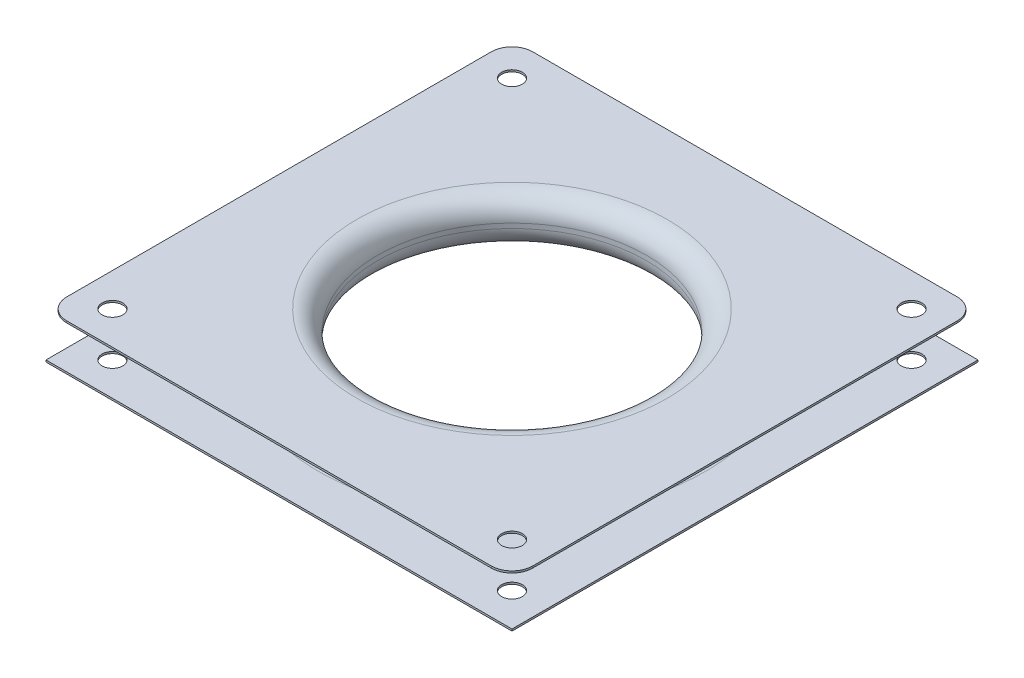
ISO-10303-21;
HEADER;
FILE_DESCRIPTION(('STEP AP214'),'2;1');
FILE_NAME('part.step','',(''),(''),'','','');
FILE_SCHEMA(('AUTOMOTIVE_DESIGN { 1 0 10303 214 1 1 1 1 }'));
ENDSEC;
DATA;
#1=APPLICATION_CONTEXT('core data for automotive mechanical design processes');
#2=APPLICATION_PROTOCOL_DEFINITION('international standard','automotive_design',2000,#1);
#3=PRODUCT_CONTEXT('',#1,'mechanical');
#4=PRODUCT('Part','Part','',(#3));
#5=PRODUCT_RELATED_PRODUCT_CATEGORY('part','',(#4));
#6=PRODUCT_DEFINITION_FORMATION('','',#4);
#7=PRODUCT_DEFINITION_CONTEXT('part definition',#1,'design');
#8=PRODUCT_DEFINITION('design','',#6,#7);
#9=PRODUCT_DEFINITION_SHAPE('','',#8);
#10=(LENGTH_UNIT() NAMED_UNIT(*) SI_UNIT(.MILLI.,.METRE.));
#11=(NAMED_UNIT(*) PLANE_ANGLE_UNIT() SI_UNIT($,.RADIAN.));
#12=(NAMED_UNIT(*) SI_UNIT($,.STERADIAN.) SOLID_ANGLE_UNIT());
#13=UNCERTAINTY_MEASURE_WITH_UNIT(LENGTH_MEASURE(1.E-05),#10,'distance_accuracy_value','');
#14=(GEOMETRIC_REPRESENTATION_CONTEXT(3) GLOBAL_UNCERTAINTY_ASSIGNED_CONTEXT((#13)) GLOBAL_UNIT_ASSIGNED_CONTEXT((#10,
#11,#12)) REPRESENTATION_CONTEXT('',''));
#15=CARTESIAN_POINT('',(0.,0.,0.));
#16=DIRECTION('',(0.,0.,1.));
#17=DIRECTION('',(1.,0.,0.));
#18=AXIS2_PLACEMENT_3D('',#15,#16,#17);
#19=CARTESIAN_POINT('',(47.25,9.35,47.25));
#20=DIRECTION('',(-1.,0.,0.));
#21=DIRECTION('',(0.,0.,1.));
#22=AXIS2_PLACEMENT_3D('',#19,#20,#21);
#23=PLANE('',#22);
#24=DIRECTION('',(0.,-1.,0.));
#25=VECTOR('',#24,1.);
#26=CARTESIAN_POINT('',(47.25,9.35,-47.25));
#27=LINE('',#26,#25);
#28=CARTESIAN_POINT('',(47.25,0.380999999999999,-47.25));
#29=VERTEX_POINT('',#28);
#30=CARTESIAN_POINT('',(47.25,0.,-47.25));
#31=VERTEX_POINT('',#30);
#32=EDGE_CURVE('E150',#29,#31,#27,.T.);
#33=ORIENTED_EDGE('',*,*,#32,.F.);
#34=DIRECTION('',(0.,0.,1.));
#35=VECTOR('',#34,1.);
#36=CARTESIAN_POINT('',(47.25,0.380999999999999,47.25));
#37=LINE('',#36,#35);
#38=CARTESIAN_POINT('',(47.25,0.380999999999999,47.25));
#39=VERTEX_POINT('',#38);
#40=EDGE_CURVE('E135',#29,#39,#37,.T.);
#41=ORIENTED_EDGE('',*,*,#40,.T.);
#42=DIRECTION('',(0.,-1.,0.));
#43=VECTOR('',#42,1.);
#44=CARTESIAN_POINT('',(47.25,9.35,47.25));
#45=LINE('',#44,#43);
#46=CARTESIAN_POINT('',(47.25,0.,47.25));
#47=VERTEX_POINT('',#46);
#48=EDGE_CURVE('E148',#39,#47,#45,.T.);
#49=ORIENTED_EDGE('',*,*,#48,.T.);
#50=DIRECTION('',(0.,0.,-1.));
#51=VECTOR('',#50,1.);
#52=CARTESIAN_POINT('',(47.25,0.,47.25));
#53=LINE('',#52,#51);
#54=EDGE_CURVE('E335',#47,#31,#53,.T.);
#55=ORIENTED_EDGE('',*,*,#54,.T.);
#56=EDGE_LOOP('',(#33,#41,#49,#55));
#57=FACE_BOUND('',#56,.T.);
#58=ADVANCED_FACE('F43',(#57),#23,.F.);
#59=CARTESIAN_POINT('',(-47.25,9.35,-47.25));
#60=DIRECTION('',(0.,0.,1.));
#61=DIRECTION('',(1.,0.,0.));
#62=AXIS2_PLACEMENT_3D('',#59,#60,#61);
#63=PLANE('',#62);
#64=DIRECTION('',(0.,-1.,0.));
#65=VECTOR('',#64,1.);
#66=CARTESIAN_POINT('',(-47.25,9.35,-47.25));
#67=LINE('',#66,#65);
#68=CARTESIAN_POINT('',(-47.25,0.380999999999999,-47.25));
#69=VERTEX_POINT('',#68);
#70=CARTESIAN_POINT('',(-47.25,0.,-47.25));
#71=VERTEX_POINT('',#70);
#72=EDGE_CURVE('E165',#69,#71,#67,.T.);
#73=ORIENTED_EDGE('',*,*,#72,.F.);
#74=DIRECTION('',(1.,0.,0.));
#75=VECTOR('',#74,1.);
#76=CARTESIAN_POINT('',(-47.25,0.380999999999999,-47.25));
#77=LINE('',#76,#75);
#78=EDGE_CURVE('E153',#69,#29,#77,.T.);
#79=ORIENTED_EDGE('',*,*,#78,.T.);
#80=ORIENTED_EDGE('',*,*,#32,.T.);
#81=DIRECTION('',(-1.,0.,0.));
#82=VECTOR('',#81,1.);
#83=CARTESIAN_POINT('',(-47.25,0.,-47.25));
#84=LINE('',#83,#82);
#85=EDGE_CURVE('E351',#31,#71,#84,.T.);
#86=ORIENTED_EDGE('',*,*,#85,.T.);
#87=EDGE_LOOP('',(#73,#79,#80,#86));
#88=FACE_BOUND('',#87,.T.);
#89=ADVANCED_FACE('F367',(#88),#63,.F.);
#90=CARTESIAN_POINT('',(-47.25,9.35,47.25));
#91=DIRECTION('',(1.,0.,0.));
#92=DIRECTION('',(0.,0.,-1.));
#93=AXIS2_PLACEMENT_3D('',#90,#91,#92);
#94=PLANE('',#93);
#95=DIRECTION('',(0.,-1.,0.));
#96=VECTOR('',#95,1.);
#97=CARTESIAN_POINT('',(-47.25,9.35,47.25));
#98=LINE('',#97,#96);
#99=CARTESIAN_POINT('',(-47.25,0.380999999999999,47.25));
#100=VERTEX_POINT('',#99);
#101=CARTESIAN_POINT('',(-47.25,0.,47.25));
#102=VERTEX_POINT('',#101);
#103=EDGE_CURVE('E160',#100,#102,#98,.T.);
#104=ORIENTED_EDGE('',*,*,#103,.F.);
#105=DIRECTION('',(0.,0.,-1.));
#106=VECTOR('',#105,1.);
#107=CARTESIAN_POINT('',(-47.25,0.380999999999999,47.25));
#108=LINE('',#107,#106);
#109=EDGE_CURVE('E138',#100,#69,#108,.T.);
#110=ORIENTED_EDGE('',*,*,#109,.T.);
#111=ORIENTED_EDGE('',*,*,#72,.T.);
#112=DIRECTION('',(0.,0.,1.));
#113=VECTOR('',#112,1.);
#114=CARTESIAN_POINT('',(-47.25,0.,47.25));
#115=LINE('',#114,#113);
#116=EDGE_CURVE('E354',#71,#102,#115,.T.);
#117=ORIENTED_EDGE('',*,*,#116,.T.);
#118=EDGE_LOOP('',(#104,#110,#111,#117));
#119=FACE_BOUND('',#118,.T.);
#120=ADVANCED_FACE('F360',(#119),#94,.F.);
#121=CARTESIAN_POINT('',(-47.25,9.35,47.25));
#122=DIRECTION('',(0.,0.,-1.));
#123=DIRECTION('',(-1.,0.,0.));
#124=AXIS2_PLACEMENT_3D('',#121,#122,#123);
#125=PLANE('',#124);
#126=ORIENTED_EDGE('',*,*,#48,.F.);
#127=DIRECTION('',(-1.,0.,0.));
#128=VECTOR('',#127,1.);
#129=CARTESIAN_POINT('',(-47.25,0.380999999999999,47.25));
#130=LINE('',#129,#128);
#131=EDGE_CURVE('E132',#39,#100,#130,.T.);
#132=ORIENTED_EDGE('',*,*,#131,.T.);
#133=ORIENTED_EDGE('',*,*,#103,.T.);
#134=DIRECTION('',(1.,0.,0.));
#135=VECTOR('',#134,1.);
#136=CARTESIAN_POINT('',(-47.25,0.,47.25));
#137=LINE('',#136,#135);
#138=EDGE_CURVE('E157',#102,#47,#137,.T.);
#139=ORIENTED_EDGE('',*,*,#138,.T.);
#140=EDGE_LOOP('',(#126,#132,#133,#139));
#141=FACE_BOUND('',#140,.T.);
#142=ADVANCED_FACE('F155',(#141),#125,.F.);
#143=CARTESIAN_POINT('',(-40.513,9.35,-40.513));
#144=DIRECTION('',(0.,-1.,0.));
#145=DIRECTION('',(0.,0.,-1.));
#146=AXIS2_PLACEMENT_3D('',#143,#144,#145);
#147=CYLINDRICAL_SURFACE('',#146,2.1);
#148=CARTESIAN_POINT('',(-40.513,0.380999999999999,-40.513));
#149=DIRECTION('',(0.,-1.,0.));
#150=DIRECTION('',(0.,0.,-1.));
#151=AXIS2_PLACEMENT_3D('',#148,#149,#150);
#152=CIRCLE('',#151,2.1);
#153=CARTESIAN_POINT('',(-40.513,0.380999999999999,-42.613));
#154=VERTEX_POINT('',#153);
#155=EDGE_CURVE('E143',#154,#154,#152,.T.);
#156=ORIENTED_EDGE('',*,*,#155,.F.);
#157=EDGE_LOOP('',(#156));
#158=FACE_BOUND('',#157,.T.);
#159=CARTESIAN_POINT('',(-40.513,0.,-40.513));
#160=DIRECTION('',(0.,1.,0.));
#161=DIRECTION('',(0.,0.,1.));
#162=AXIS2_PLACEMENT_3D('',#159,#160,#161);
#163=CIRCLE('',#162,2.1);
#164=CARTESIAN_POINT('',(-40.513,0.,-38.413));
#165=VERTEX_POINT('',#164);
#166=EDGE_CURVE('E327',#165,#165,#163,.T.);
#167=ORIENTED_EDGE('',*,*,#166,.F.);
#168=EDGE_LOOP('',(#167));
#169=FACE_BOUND('',#168,.T.);
#170=ADVANCED_FACE('F463',(#158,#169),#147,.F.);
#171=CARTESIAN_POINT('',(40.513,9.35,-40.513));
#172=DIRECTION('',(0.,-1.,0.));
#173=DIRECTION('',(0.,0.,-1.));
#174=AXIS2_PLACEMENT_3D('',#171,#172,#173);
#175=CYLINDRICAL_SURFACE('',#174,2.1);
#176=CARTESIAN_POINT('',(40.513,0.380999999999999,-40.513));
#177=DIRECTION('',(0.,-1.,0.));
#178=DIRECTION('',(0.,0.,-1.));
#179=AXIS2_PLACEMENT_3D('',#176,#177,#178);
#180=CIRCLE('',#179,2.1);
#181=CARTESIAN_POINT('',(40.513,0.380999999999999,-42.613));
#182=VERTEX_POINT('',#181);
#183=EDGE_CURVE('E296',#182,#182,#180,.T.);
#184=ORIENTED_EDGE('',*,*,#183,.F.);
#185=EDGE_LOOP('',(#184));
#186=FACE_BOUND('',#185,.T.);
#187=CARTESIAN_POINT('',(40.513,0.,-40.513));
#188=DIRECTION('',(0.,1.,0.));
#189=DIRECTION('',(0.,0.,1.));
#190=AXIS2_PLACEMENT_3D('',#187,#188,#189);
#191=CIRCLE('',#190,2.1);
#192=CARTESIAN_POINT('',(40.513,0.,-38.413));
#193=VERTEX_POINT('',#192);
#194=EDGE_CURVE('E319',#193,#193,#191,.T.);
#195=ORIENTED_EDGE('',*,*,#194,.F.);
#196=EDGE_LOOP('',(#195));
#197=FACE_BOUND('',#196,.T.);
#198=ADVANCED_FACE('F495',(#186,#197),#175,.F.);
#199=CARTESIAN_POINT('',(40.513,9.35,40.513));
#200=DIRECTION('',(0.,-1.,0.));
#201=DIRECTION('',(0.,0.,-1.));
#202=AXIS2_PLACEMENT_3D('',#199,#200,#201);
#203=CYLINDRICAL_SURFACE('',#202,2.1);
#204=CARTESIAN_POINT('',(40.513,0.380999999999999,40.513));
#205=DIRECTION('',(0.,-1.,0.));
#206=DIRECTION('',(0.,0.,-1.));
#207=AXIS2_PLACEMENT_3D('',#204,#205,#206);
#208=CIRCLE('',#207,2.1);
#209=CARTESIAN_POINT('',(40.513,0.380999999999999,38.413));
#210=VERTEX_POINT('',#209);
#211=EDGE_CURVE('E186',#210,#210,#208,.T.);
#212=ORIENTED_EDGE('',*,*,#211,.F.);
#213=EDGE_LOOP('',(#212));
#214=FACE_BOUND('',#213,.T.);
#215=CARTESIAN_POINT('',(40.513,0.,40.513));
#216=DIRECTION('',(0.,1.,0.));
#217=DIRECTION('',(0.,0.,1.));
#218=AXIS2_PLACEMENT_3D('',#215,#216,#217);
#219=CIRCLE('',#218,2.1);
#220=CARTESIAN_POINT('',(40.513,0.,42.613));
#221=VERTEX_POINT('',#220);
#222=EDGE_CURVE('E311',#221,#221,#219,.T.);
#223=ORIENTED_EDGE('',*,*,#222,.F.);
#224=EDGE_LOOP('',(#223));
#225=FACE_BOUND('',#224,.T.);
#226=ADVANCED_FACE('F489',(#214,#225),#203,.F.);
#227=CARTESIAN_POINT('',(-40.513,9.35,40.513));
#228=DIRECTION('',(0.,-1.,0.));
#229=DIRECTION('',(0.,0.,-1.));
#230=AXIS2_PLACEMENT_3D('',#227,#228,#229);
#231=CYLINDRICAL_SURFACE('',#230,2.1);
#232=CARTESIAN_POINT('',(-40.513,0.380999999999999,40.513));
#233=DIRECTION('',(0.,-1.,0.));
#234=DIRECTION('',(0.,0.,-1.));
#235=AXIS2_PLACEMENT_3D('',#232,#233,#234);
#236=CIRCLE('',#235,2.1);
#237=CARTESIAN_POINT('',(-40.513,0.380999999999999,38.413));
#238=VERTEX_POINT('',#237);
#239=EDGE_CURVE('E182',#238,#238,#236,.T.);
#240=ORIENTED_EDGE('',*,*,#239,.F.);
#241=EDGE_LOOP('',(#240));
#242=FACE_BOUND('',#241,.T.);
#243=CARTESIAN_POINT('',(-40.513,0.,40.513));
#244=DIRECTION('',(0.,1.,0.));
#245=DIRECTION('',(0.,0.,1.));
#246=AXIS2_PLACEMENT_3D('',#243,#244,#245);
#247=CIRCLE('',#246,2.1);
#248=CARTESIAN_POINT('',(-40.513,0.,42.613));
#249=VERTEX_POINT('',#248);
#250=EDGE_CURVE('E152',#249,#249,#247,.T.);
#251=ORIENTED_EDGE('',*,*,#250,.F.);
#252=EDGE_LOOP('',(#251));
#253=FACE_BOUND('',#252,.T.);
#254=ADVANCED_FACE('F467',(#242,#253),#231,.F.);
#255=CARTESIAN_POINT('',(0.,9.35,0.));
#256=DIRECTION('',(0.,-1.,0.));
#257=DIRECTION('',(0.,0.,-1.));
#258=AXIS2_PLACEMENT_3D('',#255,#256,#257);
#259=PLANE('',#258);
#260=CARTESIAN_POINT('',(0.,9.35,0.));
#261=DIRECTION('',(0.,-1.,0.));
#262=DIRECTION('',(0.,0.,-1.));
#263=AXIS2_PLACEMENT_3D('',#260,#261,#262);
#264=CIRCLE('',#263,31.45);
#265=CARTESIAN_POINT('',(0.,9.35,-31.45));
#266=VERTEX_POINT('',#265);
#267=EDGE_CURVE('E238',#266,#266,#264,.T.);
#268=ORIENTED_EDGE('',*,*,#267,.T.);
#269=EDGE_LOOP('',(#268));
#270=FACE_BOUND('',#269,.T.);
#271=DIRECTION('',(-1.,0.,0.));
#272=VECTOR('',#271,1.);
#273=CARTESIAN_POINT('',(-47.25,9.35,-47.25));
#274=LINE('',#273,#272);
#275=CARTESIAN_POINT('',(43.05,9.35,-47.25));
#276=VERTEX_POINT('',#275);
#277=CARTESIAN_POINT('',(-43.05,9.35,-47.25));
#278=VERTEX_POINT('',#277);
#279=EDGE_CURVE('E343',#276,#278,#274,.T.);
#280=ORIENTED_EDGE('',*,*,#279,.T.);
#281=CARTESIAN_POINT('',(-43.05,9.35,-43.05));
#282=DIRECTION('',(0.,-1.,0.));
#283=DIRECTION('',(0.,0.,-1.));
#284=AXIS2_PLACEMENT_3D('',#281,#282,#283);
#285=CIRCLE('',#284,4.2);
#286=CARTESIAN_POINT('',(-47.25,9.35,-43.05));
#287=VERTEX_POINT('',#286);
#288=EDGE_CURVE('E235',#278,#287,#285,.F.);
#289=ORIENTED_EDGE('',*,*,#288,.T.);
#290=DIRECTION('',(0.,0.,1.));
#291=VECTOR('',#290,1.);
#292=CARTESIAN_POINT('',(-47.25,9.35,47.25));
#293=LINE('',#292,#291);
#294=CARTESIAN_POINT('',(-47.25,9.35,43.05));
#295=VERTEX_POINT('',#294);
#296=EDGE_CURVE('E167',#287,#295,#293,.T.);
#297=ORIENTED_EDGE('',*,*,#296,.T.);
#298=CARTESIAN_POINT('',(-43.05,9.35,43.05));
#299=DIRECTION('',(0.,-1.,0.));
#300=DIRECTION('',(0.,0.,-1.));
#301=AXIS2_PLACEMENT_3D('',#298,#299,#300);
#302=CIRCLE('',#301,4.2);
#303=CARTESIAN_POINT('',(-43.05,9.35,47.25));
#304=VERTEX_POINT('',#303);
#305=EDGE_CURVE('E64',#295,#304,#302,.F.);
#306=ORIENTED_EDGE('',*,*,#305,.T.);
#307=DIRECTION('',(1.,0.,0.));
#308=VECTOR('',#307,1.);
#309=CARTESIAN_POINT('',(-47.25,9.35,47.25));
#310=LINE('',#309,#308);
#311=CARTESIAN_POINT('',(43.05,9.35,47.25));
#312=VERTEX_POINT('',#311);
#313=EDGE_CURVE('E161',#304,#312,#310,.T.);
#314=ORIENTED_EDGE('',*,*,#313,.T.);
#315=CARTESIAN_POINT('',(43.05,9.35,43.05));
#316=DIRECTION('',(0.,-1.,0.));
#317=DIRECTION('',(0.,0.,-1.));
#318=AXIS2_PLACEMENT_3D('',#315,#316,#317);
#319=CIRCLE('',#318,4.2);
#320=CARTESIAN_POINT('',(47.25,9.35,43.05));
#321=VERTEX_POINT('',#320);
#322=EDGE_CURVE('E229',#312,#321,#319,.F.);
#323=ORIENTED_EDGE('',*,*,#322,.T.);
#324=DIRECTION('',(0.,0.,-1.));
#325=VECTOR('',#324,1.);
#326=CARTESIAN_POINT('',(47.25,9.35,47.25));
#327=LINE('',#326,#325);
#328=CARTESIAN_POINT('',(47.25,9.35,-43.05));
#329=VERTEX_POINT('',#328);
#330=EDGE_CURVE('E339',#321,#329,#327,.T.);
#331=ORIENTED_EDGE('',*,*,#330,.T.);
#332=CARTESIAN_POINT('',(43.05,9.35,-43.05));
#333=DIRECTION('',(0.,-1.,0.));
#334=DIRECTION('',(0.,0.,-1.));
#335=AXIS2_PLACEMENT_3D('',#332,#333,#334);
#336=CIRCLE('',#335,4.2);
#337=EDGE_CURVE('E232',#329,#276,#336,.F.);
#338=ORIENTED_EDGE('',*,*,#337,.T.);
#339=EDGE_LOOP('',(#280,#289,#297,#306,#314,#323,#331,#338));
#340=FACE_BOUND('',#339,.T.);
#341=CARTESIAN_POINT('',(-40.513,9.35,-40.513));
#342=DIRECTION('',(0.,1.,0.));
#343=DIRECTION('',(0.,0.,1.));
#344=AXIS2_PLACEMENT_3D('',#341,#342,#343);
#345=CIRCLE('',#344,2.1);
#346=CARTESIAN_POINT('',(-40.513,9.35,-38.413));
#347=VERTEX_POINT('',#346);
#348=EDGE_CURVE('E331',#347,#347,#345,.T.);
#349=ORIENTED_EDGE('',*,*,#348,.F.);
#350=EDGE_LOOP('',(#349));
#351=FACE_BOUND('',#350,.T.);
#352=CARTESIAN_POINT('',(40.513,9.35,-40.513));
#353=DIRECTION('',(0.,1.,0.));
#354=DIRECTION('',(0.,0.,1.));
#355=AXIS2_PLACEMENT_3D('',#352,#353,#354);
#356=CIRCLE('',#355,2.1);
#357=CARTESIAN_POINT('',(40.513,9.35,-38.413));
#358=VERTEX_POINT('',#357);
#359=EDGE_CURVE('E323',#358,#358,#356,.T.);
#360=ORIENTED_EDGE('',*,*,#359,.F.);
#361=EDGE_LOOP('',(#360));
#362=FACE_BOUND('',#361,.T.);
#363=CARTESIAN_POINT('',(40.513,9.35,40.513));
#364=DIRECTION('',(0.,1.,0.));
#365=DIRECTION('',(0.,0.,1.));
#366=AXIS2_PLACEMENT_3D('',#363,#364,#365);
#367=CIRCLE('',#366,2.1);
#368=CARTESIAN_POINT('',(40.513,9.35,42.613));
#369=VERTEX_POINT('',#368);
#370=EDGE_CURVE('E315',#369,#369,#367,.T.);
#371=ORIENTED_EDGE('',*,*,#370,.F.);
#372=EDGE_LOOP('',(#371));
#373=FACE_BOUND('',#372,.T.);
#374=CARTESIAN_POINT('',(-40.513,9.35,40.513));
#375=DIRECTION('',(0.,1.,0.));
#376=DIRECTION('',(0.,0.,1.));
#377=AXIS2_PLACEMENT_3D('',#374,#375,#376);
#378=CIRCLE('',#377,2.1);
#379=CARTESIAN_POINT('',(-40.513,9.35,42.613));
#380=VERTEX_POINT('',#379);
#381=EDGE_CURVE('E307',#380,#380,#378,.T.);
#382=ORIENTED_EDGE('',*,*,#381,.F.);
#383=EDGE_LOOP('',(#382));
#384=FACE_BOUND('',#383,.T.);
#385=ADVANCED_FACE('F396',(#270,#340,#351,#362,#373,#384),#259,.F.);
#386=CARTESIAN_POINT('',(0.,0.,0.));
#387=DIRECTION('',(0.,-1.,0.));
#388=DIRECTION('',(0.,0.,-1.));
#389=AXIS2_PLACEMENT_3D('',#386,#387,#388);
#390=PLANE('',#389);
#391=CARTESIAN_POINT('',(0.,0.,0.));
#392=DIRECTION('',(0.,-1.,0.));
#393=DIRECTION('',(0.,0.,-1.));
#394=AXIS2_PLACEMENT_3D('',#391,#392,#393);
#395=CIRCLE('',#394,31.45);
#396=CARTESIAN_POINT('',(0.,0.,-31.45));
#397=VERTEX_POINT('',#396);
#398=EDGE_CURVE('E215',#397,#397,#395,.F.);
#399=ORIENTED_EDGE('',*,*,#398,.T.);
#400=EDGE_LOOP('',(#399));
#401=FACE_BOUND('',#400,.T.);
#402=ORIENTED_EDGE('',*,*,#222,.T.);
#403=EDGE_LOOP('',(#402));
#404=FACE_BOUND('',#403,.T.);
#405=ORIENTED_EDGE('',*,*,#166,.T.);
#406=EDGE_LOOP('',(#405));
#407=FACE_BOUND('',#406,.T.);
#408=ORIENTED_EDGE('',*,*,#54,.F.);
#409=ORIENTED_EDGE('',*,*,#138,.F.);
#410=ORIENTED_EDGE('',*,*,#116,.F.);
#411=ORIENTED_EDGE('',*,*,#85,.F.);
#412=EDGE_LOOP('',(#408,#409,#410,#411));
#413=FACE_BOUND('',#412,.T.);
#414=ORIENTED_EDGE('',*,*,#194,.T.);
#415=EDGE_LOOP('',(#414));
#416=FACE_BOUND('',#415,.T.);
#417=ORIENTED_EDGE('',*,*,#250,.T.);
#418=EDGE_LOOP('',(#417));
#419=FACE_BOUND('',#418,.T.);
#420=ADVANCED_FACE('F364',(#401,#404,#407,#413,#416,#419),#390,.T.);
#421=DIRECTION('',(0.,0.,-1.));
#422=VECTOR('',#421,1.);
#423=CARTESIAN_POINT('',(47.25,8.969,47.25));
#424=LINE('',#423,#422);
#425=CARTESIAN_POINT('',(47.25,8.969,43.05));
#426=VERTEX_POINT('',#425);
#427=CARTESIAN_POINT('',(47.25,8.969,-43.05));
#428=VERTEX_POINT('',#427);
#429=EDGE_CURVE('E187',#426,#428,#424,.T.);
#430=ORIENTED_EDGE('',*,*,#429,.T.);
#431=DIRECTION('',(0.,-1.,0.));
#432=VECTOR('',#431,1.);
#433=CARTESIAN_POINT('',(47.25,9.35,-43.05));
#434=LINE('',#433,#432);
#435=EDGE_CURVE('E260',#428,#329,#434,.F.);
#436=ORIENTED_EDGE('',*,*,#435,.T.);
#437=ORIENTED_EDGE('',*,*,#330,.F.);
#438=DIRECTION('',(0.,-1.,0.));
#439=VECTOR('',#438,1.);
#440=CARTESIAN_POINT('',(47.25,9.35,43.05));
#441=LINE('',#440,#439);
#442=EDGE_CURVE('E256',#321,#426,#441,.T.);
#443=ORIENTED_EDGE('',*,*,#442,.T.);
#444=EDGE_LOOP('',(#430,#436,#437,#443));
#445=FACE_BOUND('',#444,.T.);
#446=ADVANCED_FACE('F378',(#445),#23,.F.);
#447=DIRECTION('',(-1.,0.,0.));
#448=VECTOR('',#447,1.);
#449=CARTESIAN_POINT('',(-47.25,8.969,-47.25));
#450=LINE('',#449,#448);
#451=CARTESIAN_POINT('',(43.05,8.969,-47.25));
#452=VERTEX_POINT('',#451);
#453=CARTESIAN_POINT('',(-43.05,8.969,-47.25));
#454=VERTEX_POINT('',#453);
#455=EDGE_CURVE('E280',#452,#454,#450,.T.);
#456=ORIENTED_EDGE('',*,*,#455,.T.);
#457=DIRECTION('',(0.,-1.,0.));
#458=VECTOR('',#457,1.);
#459=CARTESIAN_POINT('',(-43.05,9.35,-47.25));
#460=LINE('',#459,#458);
#461=EDGE_CURVE('E253',#454,#278,#460,.F.);
#462=ORIENTED_EDGE('',*,*,#461,.T.);
#463=ORIENTED_EDGE('',*,*,#279,.F.);
#464=DIRECTION('',(0.,-1.,0.));
#465=VECTOR('',#464,1.);
#466=CARTESIAN_POINT('',(43.05,9.35,-47.25));
#467=LINE('',#466,#465);
#468=EDGE_CURVE('E249',#276,#452,#467,.T.);
#469=ORIENTED_EDGE('',*,*,#468,.T.);
#470=EDGE_LOOP('',(#456,#462,#463,#469));
#471=FACE_BOUND('',#470,.T.);
#472=ADVANCED_FACE('F370',(#471),#63,.F.);
#473=ORIENTED_EDGE('',*,*,#296,.F.);
#474=DIRECTION('',(0.,-1.,0.));
#475=VECTOR('',#474,1.);
#476=CARTESIAN_POINT('',(-47.25,9.35,-43.05));
#477=LINE('',#476,#475);
#478=CARTESIAN_POINT('',(-47.25,8.969,-43.05));
#479=VERTEX_POINT('',#478);
#480=EDGE_CURVE('E245',#287,#479,#477,.T.);
#481=ORIENTED_EDGE('',*,*,#480,.T.);
#482=DIRECTION('',(0.,0.,1.));
#483=VECTOR('',#482,1.);
#484=CARTESIAN_POINT('',(-47.25,8.969,47.25));
#485=LINE('',#484,#483);
#486=CARTESIAN_POINT('',(-47.25,8.969,43.05));
#487=VERTEX_POINT('',#486);
#488=EDGE_CURVE('E275',#479,#487,#485,.T.);
#489=ORIENTED_EDGE('',*,*,#488,.T.);
#490=DIRECTION('',(0.,-1.,0.));
#491=VECTOR('',#490,1.);
#492=CARTESIAN_POINT('',(-47.25,9.35,43.05));
#493=LINE('',#492,#491);
#494=EDGE_CURVE('E242',#487,#295,#493,.F.);
#495=ORIENTED_EDGE('',*,*,#494,.T.);
#496=EDGE_LOOP('',(#473,#481,#489,#495));
#497=FACE_BOUND('',#496,.T.);
#498=ADVANCED_FACE('F376',(#497),#94,.F.);
#499=DIRECTION('',(1.,0.,0.));
#500=VECTOR('',#499,1.);
#501=CARTESIAN_POINT('',(-47.25,8.969,47.25));
#502=LINE('',#501,#500);
#503=CARTESIAN_POINT('',(-43.05,8.969,47.25));
#504=VERTEX_POINT('',#503);
#505=CARTESIAN_POINT('',(43.05,8.969,47.25));
#506=VERTEX_POINT('',#505);
#507=EDGE_CURVE('E267',#504,#506,#502,.T.);
#508=ORIENTED_EDGE('',*,*,#507,.T.);
#509=DIRECTION('',(0.,-1.,0.));
#510=VECTOR('',#509,1.);
#511=CARTESIAN_POINT('',(43.05,9.35,47.25));
#512=LINE('',#511,#510);
#513=EDGE_CURVE('E11',#506,#312,#512,.F.);
#514=ORIENTED_EDGE('',*,*,#513,.T.);
#515=ORIENTED_EDGE('',*,*,#313,.F.);
#516=DIRECTION('',(0.,-1.,0.));
#517=VECTOR('',#516,1.);
#518=CARTESIAN_POINT('',(-43.05,9.35,47.25));
#519=LINE('',#518,#517);
#520=EDGE_CURVE('E52',#304,#504,#519,.T.);
#521=ORIENTED_EDGE('',*,*,#520,.T.);
#522=EDGE_LOOP('',(#508,#514,#515,#521));
#523=FACE_BOUND('',#522,.T.);
#524=ADVANCED_FACE('F266',(#523),#125,.F.);
#525=CARTESIAN_POINT('',(0.,9.35,0.));
#526=DIRECTION('',(0.,-1.,0.));
#527=DIRECTION('',(0.,0.,-1.));
#528=AXIS2_PLACEMENT_3D('',#525,#526,#527);
#529=CYLINDRICAL_SURFACE('',#528,27.25);
#530=CARTESIAN_POINT('',(0.,4.2,0.));
#531=DIRECTION('',(0.,-1.,0.));
#532=DIRECTION('',(0.,0.,-1.));
#533=AXIS2_PLACEMENT_3D('',#530,#531,#532);
#534=CIRCLE('',#533,27.25);
#535=CARTESIAN_POINT('',(0.,4.2,-27.25));
#536=VERTEX_POINT('',#535);
#537=EDGE_CURVE('E223',#536,#536,#534,.T.);
#538=ORIENTED_EDGE('',*,*,#537,.T.);
#539=EDGE_LOOP('',(#538));
#540=FACE_BOUND('',#539,.T.);
#541=CARTESIAN_POINT('',(0.,5.15,0.));
#542=DIRECTION('',(0.,-1.,0.));
#543=DIRECTION('',(0.,0.,-1.));
#544=AXIS2_PLACEMENT_3D('',#541,#542,#543);
#545=CIRCLE('',#544,27.25);
#546=CARTESIAN_POINT('',(0.,5.15,-27.25));
#547=VERTEX_POINT('',#546);
#548=EDGE_CURVE('E219',#547,#547,#545,.F.);
#549=ORIENTED_EDGE('',*,*,#548,.T.);
#550=EDGE_LOOP('',(#549));
#551=FACE_BOUND('',#550,.T.);
#552=ADVANCED_FACE('F461',(#540,#551),#529,.F.);
#553=CARTESIAN_POINT('',(-40.513,8.969,-40.513));
#554=DIRECTION('',(0.,1.,0.));
#555=DIRECTION('',(0.,0.,1.));
#556=AXIS2_PLACEMENT_3D('',#553,#554,#555);
#557=CIRCLE('',#556,2.1);
#558=CARTESIAN_POINT('',(-40.513,8.969,-38.413));
#559=VERTEX_POINT('',#558);
#560=EDGE_CURVE('E276',#559,#559,#557,.T.);
#561=ORIENTED_EDGE('',*,*,#560,.F.);
#562=EDGE_LOOP('',(#561));
#563=FACE_BOUND('',#562,.T.);
#564=ORIENTED_EDGE('',*,*,#348,.T.);
#565=EDGE_LOOP('',(#564));
#566=FACE_BOUND('',#565,.T.);
#567=ADVANCED_FACE('F457',(#563,#566),#147,.F.);
#568=CARTESIAN_POINT('',(40.513,8.969,-40.513));
#569=DIRECTION('',(0.,1.,0.));
#570=DIRECTION('',(0.,0.,1.));
#571=AXIS2_PLACEMENT_3D('',#568,#569,#570);
#572=CIRCLE('',#571,2.1);
#573=CARTESIAN_POINT('',(40.513,8.969,-38.413));
#574=VERTEX_POINT('',#573);
#575=EDGE_CURVE('E283',#574,#574,#572,.T.);
#576=ORIENTED_EDGE('',*,*,#575,.F.);
#577=EDGE_LOOP('',(#576));
#578=FACE_BOUND('',#577,.T.);
#579=ORIENTED_EDGE('',*,*,#359,.T.);
#580=EDGE_LOOP('',(#579));
#581=FACE_BOUND('',#580,.T.);
#582=ADVANCED_FACE('F460',(#578,#581),#175,.F.);
#583=CARTESIAN_POINT('',(40.513,8.969,40.513));
#584=DIRECTION('',(0.,1.,0.));
#585=DIRECTION('',(0.,0.,1.));
#586=AXIS2_PLACEMENT_3D('',#583,#584,#585);
#587=CIRCLE('',#586,2.1);
#588=CARTESIAN_POINT('',(40.513,8.969,42.613));
#589=VERTEX_POINT('',#588);
#590=EDGE_CURVE('E181',#589,#589,#587,.T.);
#591=ORIENTED_EDGE('',*,*,#590,.F.);
#592=EDGE_LOOP('',(#591));
#593=FACE_BOUND('',#592,.T.);
#594=ORIENTED_EDGE('',*,*,#370,.T.);
#595=EDGE_LOOP('',(#594));
#596=FACE_BOUND('',#595,.T.);
#597=ADVANCED_FACE('F478',(#593,#596),#203,.F.);
#598=CARTESIAN_POINT('',(-40.513,8.969,40.513));
#599=DIRECTION('',(0.,1.,0.));
#600=DIRECTION('',(0.,0.,1.));
#601=AXIS2_PLACEMENT_3D('',#598,#599,#600);
#602=CIRCLE('',#601,2.1);
#603=CARTESIAN_POINT('',(-40.513,8.969,42.613));
#604=VERTEX_POINT('',#603);
#605=EDGE_CURVE('E177',#604,#604,#602,.T.);
#606=ORIENTED_EDGE('',*,*,#605,.F.);
#607=EDGE_LOOP('',(#606));
#608=FACE_BOUND('',#607,.T.);
#609=ORIENTED_EDGE('',*,*,#381,.T.);
#610=EDGE_LOOP('',(#609));
#611=FACE_BOUND('',#610,.T.);
#612=ADVANCED_FACE('F476',(#608,#611),#231,.F.);
#613=CARTESIAN_POINT('',(-35.,0.380999999999999,0.));
#614=DIRECTION('',(0.,-1.,0.));
#615=DIRECTION('',(0.,0.,-1.));
#616=AXIS2_PLACEMENT_3D('',#613,#614,#615);
#617=PLANE('',#616);
#618=CARTESIAN_POINT('',(0.,0.380999999999999,0.));
#619=DIRECTION('',(0.,-1.,0.));
#620=DIRECTION('',(0.,0.,-1.));
#621=AXIS2_PLACEMENT_3D('',#618,#619,#620);
#622=CIRCLE('',#621,39.2);
#623=CARTESIAN_POINT('',(0.,0.380999999999999,-39.2));
#624=VERTEX_POINT('',#623);
#625=EDGE_CURVE('E195',#624,#624,#622,.T.);
#626=ORIENTED_EDGE('',*,*,#625,.T.);
#627=EDGE_LOOP('',(#626));
#628=FACE_BOUND('',#627,.T.);
#629=ORIENTED_EDGE('',*,*,#239,.T.);
#630=EDGE_LOOP('',(#629));
#631=FACE_BOUND('',#630,.T.);
#632=ORIENTED_EDGE('',*,*,#211,.T.);
#633=EDGE_LOOP('',(#632));
#634=FACE_BOUND('',#633,.T.);
#635=ORIENTED_EDGE('',*,*,#183,.T.);
#636=EDGE_LOOP('',(#635));
#637=FACE_BOUND('',#636,.T.);
#638=ORIENTED_EDGE('',*,*,#155,.T.);
#639=EDGE_LOOP('',(#638));
#640=FACE_BOUND('',#639,.T.);
#641=ORIENTED_EDGE('',*,*,#78,.F.);
#642=ORIENTED_EDGE('',*,*,#109,.F.);
#643=ORIENTED_EDGE('',*,*,#131,.F.);
#644=ORIENTED_EDGE('',*,*,#40,.F.);
#645=EDGE_LOOP('',(#641,#642,#643,#644));
#646=FACE_BOUND('',#645,.T.);
#647=ADVANCED_FACE('F134',(#628,#631,#634,#637,#640,#646),#617,.F.);
#648=CARTESIAN_POINT('',(-47.25,8.969,0.));
#649=DIRECTION('',(0.,1.,0.));
#650=DIRECTION('',(0.,0.,1.));
#651=AXIS2_PLACEMENT_3D('',#648,#649,#650);
#652=PLANE('',#651);
#653=CARTESIAN_POINT('',(0.,8.969,0.));
#654=DIRECTION('',(0.,1.,0.));
#655=DIRECTION('',(0.,0.,1.));
#656=AXIS2_PLACEMENT_3D('',#653,#654,#655);
#657=CIRCLE('',#656,39.2);
#658=CARTESIAN_POINT('',(0.,8.969,39.2));
#659=VERTEX_POINT('',#658);
#660=EDGE_CURVE('E211',#659,#659,#657,.T.);
#661=ORIENTED_EDGE('',*,*,#660,.T.);
#662=EDGE_LOOP('',(#661));
#663=FACE_BOUND('',#662,.T.);
#664=ORIENTED_EDGE('',*,*,#605,.T.);
#665=EDGE_LOOP('',(#664));
#666=FACE_BOUND('',#665,.T.);
#667=ORIENTED_EDGE('',*,*,#590,.T.);
#668=EDGE_LOOP('',(#667));
#669=FACE_BOUND('',#668,.T.);
#670=ORIENTED_EDGE('',*,*,#575,.T.);
#671=EDGE_LOOP('',(#670));
#672=FACE_BOUND('',#671,.T.);
#673=ORIENTED_EDGE('',*,*,#560,.T.);
#674=EDGE_LOOP('',(#673));
#675=FACE_BOUND('',#674,.T.);
#676=ORIENTED_EDGE('',*,*,#488,.F.);
#677=CARTESIAN_POINT('',(-43.05,8.969,-43.05));
#678=DIRECTION('',(0.,1.,0.));
#679=DIRECTION('',(0.,0.,1.));
#680=AXIS2_PLACEMENT_3D('',#677,#678,#679);
#681=CIRCLE('',#680,4.2);
#682=EDGE_CURVE('E208',#479,#454,#681,.F.);
#683=ORIENTED_EDGE('',*,*,#682,.T.);
#684=ORIENTED_EDGE('',*,*,#455,.F.);
#685=CARTESIAN_POINT('',(43.05,8.969,-43.05));
#686=DIRECTION('',(0.,1.,0.));
#687=DIRECTION('',(0.,0.,1.));
#688=AXIS2_PLACEMENT_3D('',#685,#686,#687);
#689=CIRCLE('',#688,4.2);
#690=EDGE_CURVE('E205',#452,#428,#689,.F.);
#691=ORIENTED_EDGE('',*,*,#690,.T.);
#692=ORIENTED_EDGE('',*,*,#429,.F.);
#693=CARTESIAN_POINT('',(43.05,8.969,43.05));
#694=DIRECTION('',(0.,1.,0.));
#695=DIRECTION('',(0.,0.,1.));
#696=AXIS2_PLACEMENT_3D('',#693,#694,#695);
#697=CIRCLE('',#696,4.2);
#698=EDGE_CURVE('E202',#426,#506,#697,.F.);
#699=ORIENTED_EDGE('',*,*,#698,.T.);
#700=ORIENTED_EDGE('',*,*,#507,.F.);
#701=CARTESIAN_POINT('',(-43.05,8.969,43.05));
#702=DIRECTION('',(0.,1.,0.));
#703=DIRECTION('',(0.,0.,1.));
#704=AXIS2_PLACEMENT_3D('',#701,#702,#703);
#705=CIRCLE('',#704,4.2);
#706=EDGE_CURVE('E199',#504,#487,#705,.F.);
#707=ORIENTED_EDGE('',*,*,#706,.T.);
#708=EDGE_LOOP('',(#676,#683,#684,#691,#692,#699,#700,#707));
#709=FACE_BOUND('',#708,.T.);
#710=ADVANCED_FACE('F271',(#663,#666,#669,#672,#675,#709),#652,.F.);
#711=CARTESIAN_POINT('',(0.,9.35,0.));
#712=DIRECTION('',(0.,1.,0.));
#713=DIRECTION('',(0.,0.,1.));
#714=AXIS2_PLACEMENT_3D('',#711,#712,#713);
#715=CYLINDRICAL_SURFACE('',#714,35.);
#716=CARTESIAN_POINT('',(0.,4.581,0.));
#717=DIRECTION('',(0.,-1.,0.));
#718=DIRECTION('',(0.,0.,-1.));
#719=AXIS2_PLACEMENT_3D('',#716,#717,#718);
#720=CIRCLE('',#719,35.);
#721=CARTESIAN_POINT('',(0.,4.581,-35.));
#722=VERTEX_POINT('',#721);
#723=EDGE_CURVE('E191',#722,#722,#720,.F.);
#724=ORIENTED_EDGE('',*,*,#723,.T.);
#725=EDGE_LOOP('',(#724));
#726=FACE_BOUND('',#725,.T.);
#727=CARTESIAN_POINT('',(0.,4.769,0.));
#728=DIRECTION('',(0.,1.,0.));
#729=DIRECTION('',(0.,0.,1.));
#730=AXIS2_PLACEMENT_3D('',#727,#728,#729);
#731=CIRCLE('',#730,35.);
#732=CARTESIAN_POINT('',(0.,4.769,35.));
#733=VERTEX_POINT('',#732);
#734=EDGE_CURVE('E176',#733,#733,#731,.F.);
#735=ORIENTED_EDGE('',*,*,#734,.T.);
#736=EDGE_LOOP('',(#735));
#737=FACE_BOUND('',#736,.T.);
#738=ADVANCED_FACE('F429',(#726,#737),#715,.T.);
#739=CARTESIAN_POINT('',(0.,4.581,0.));
#740=DIRECTION('',(0.,-1.,0.));
#741=DIRECTION('',(0.,0.,-1.));
#742=AXIS2_PLACEMENT_3D('',#739,#740,#741);
#743=TOROIDAL_SURFACE('',#742,39.2,4.2);
#744=ORIENTED_EDGE('',*,*,#625,.F.);
#745=EDGE_LOOP('',(#744));
#746=FACE_BOUND('',#745,.T.);
#747=ORIENTED_EDGE('',*,*,#723,.F.);
#748=EDGE_LOOP('',(#747));
#749=FACE_BOUND('',#748,.T.);
#750=ADVANCED_FACE('F426',(#746,#749),#743,.F.);
#751=CARTESIAN_POINT('',(0.,4.769,0.));
#752=DIRECTION('',(0.,1.,0.));
#753=DIRECTION('',(0.,0.,1.));
#754=AXIS2_PLACEMENT_3D('',#751,#752,#753);
#755=TOROIDAL_SURFACE('',#754,39.2,4.2);
#756=ORIENTED_EDGE('',*,*,#734,.F.);
#757=EDGE_LOOP('',(#756));
#758=FACE_BOUND('',#757,.T.);
#759=ORIENTED_EDGE('',*,*,#660,.F.);
#760=EDGE_LOOP('',(#759));
#761=FACE_BOUND('',#760,.T.);
#762=ADVANCED_FACE('F422',(#758,#761),#755,.F.);
#763=CARTESIAN_POINT('',(0.,4.2,0.));
#764=DIRECTION('',(0.,-1.,0.));
#765=DIRECTION('',(0.,0.,-1.));
#766=AXIS2_PLACEMENT_3D('',#763,#764,#765);
#767=TOROIDAL_SURFACE('',#766,31.45,4.2);
#768=ORIENTED_EDGE('',*,*,#537,.F.);
#769=EDGE_LOOP('',(#768));
#770=FACE_BOUND('',#769,.T.);
#771=ORIENTED_EDGE('',*,*,#398,.F.);
#772=EDGE_LOOP('',(#771));
#773=FACE_BOUND('',#772,.T.);
#774=ADVANCED_FACE('F418',(#770,#773),#767,.T.);
#775=CARTESIAN_POINT('',(0.,5.15,0.));
#776=DIRECTION('',(0.,-1.,0.));
#777=DIRECTION('',(0.,0.,-1.));
#778=AXIS2_PLACEMENT_3D('',#775,#776,#777);
#779=TOROIDAL_SURFACE('',#778,31.45,4.2);
#780=ORIENTED_EDGE('',*,*,#267,.F.);
#781=EDGE_LOOP('',(#780));
#782=FACE_BOUND('',#781,.T.);
#783=ORIENTED_EDGE('',*,*,#548,.F.);
#784=EDGE_LOOP('',(#783));
#785=FACE_BOUND('',#784,.T.);
#786=ADVANCED_FACE('F415',(#782,#785),#779,.T.);
#787=CARTESIAN_POINT('',(-43.05,9.35,-43.05));
#788=DIRECTION('',(0.,-1.,0.));
#789=DIRECTION('',(0.,0.,-1.));
#790=AXIS2_PLACEMENT_3D('',#787,#788,#789);
#791=CYLINDRICAL_SURFACE('',#790,4.2);
#792=ORIENTED_EDGE('',*,*,#288,.F.);
#793=ORIENTED_EDGE('',*,*,#461,.F.);
#794=ORIENTED_EDGE('',*,*,#682,.F.);
#795=ORIENTED_EDGE('',*,*,#480,.F.);
#796=EDGE_LOOP('',(#792,#793,#794,#795));
#797=FACE_BOUND('',#796,.T.);
#798=ADVANCED_FACE('F393',(#797),#791,.T.);
#799=CARTESIAN_POINT('',(43.05,9.35,-43.05));
#800=DIRECTION('',(0.,-1.,0.));
#801=DIRECTION('',(0.,0.,-1.));
#802=AXIS2_PLACEMENT_3D('',#799,#800,#801);
#803=CYLINDRICAL_SURFACE('',#802,4.2);
#804=ORIENTED_EDGE('',*,*,#337,.F.);
#805=ORIENTED_EDGE('',*,*,#435,.F.);
#806=ORIENTED_EDGE('',*,*,#690,.F.);
#807=ORIENTED_EDGE('',*,*,#468,.F.);
#808=EDGE_LOOP('',(#804,#805,#806,#807));
#809=FACE_BOUND('',#808,.T.);
#810=ADVANCED_FACE('F404',(#809),#803,.T.);
#811=CARTESIAN_POINT('',(43.05,9.35,43.05));
#812=DIRECTION('',(0.,-1.,0.));
#813=DIRECTION('',(0.,0.,-1.));
#814=AXIS2_PLACEMENT_3D('',#811,#812,#813);
#815=CYLINDRICAL_SURFACE('',#814,4.2);
#816=ORIENTED_EDGE('',*,*,#322,.F.);
#817=ORIENTED_EDGE('',*,*,#513,.F.);
#818=ORIENTED_EDGE('',*,*,#698,.F.);
#819=ORIENTED_EDGE('',*,*,#442,.F.);
#820=EDGE_LOOP('',(#816,#817,#818,#819));
#821=FACE_BOUND('',#820,.T.);
#822=ADVANCED_FACE('F400',(#821),#815,.T.);
#823=CARTESIAN_POINT('',(-43.05,9.35,43.05));
#824=DIRECTION('',(0.,-1.,0.));
#825=DIRECTION('',(0.,0.,-1.));
#826=AXIS2_PLACEMENT_3D('',#823,#824,#825);
#827=CYLINDRICAL_SURFACE('',#826,4.2);
#828=ORIENTED_EDGE('',*,*,#305,.F.);
#829=ORIENTED_EDGE('',*,*,#494,.F.);
#830=ORIENTED_EDGE('',*,*,#706,.F.);
#831=ORIENTED_EDGE('',*,*,#520,.F.);
#832=EDGE_LOOP('',(#828,#829,#830,#831));
#833=FACE_BOUND('',#832,.T.);
#834=ADVANCED_FACE('F45',(#833),#827,.T.);
#835=CLOSED_SHELL('',(#58,#89,#120,#142,#170,#198,#226,#254,#385,#420,#446,#472,#498,#524,#552,
#567,#582,#597,#612,#647,#710,#738,#750,#762,#774,#786,#798,#810,#822,#834));
#836=MANIFOLD_SOLID_BREP('B2',#835);
#837=ADVANCED_BREP_SHAPE_REPRESENTATION('',(#18,#836),#14);
#838=SHAPE_DEFINITION_REPRESENTATION(#9,#837);
ENDSEC;
END-ISO-10303-21;
